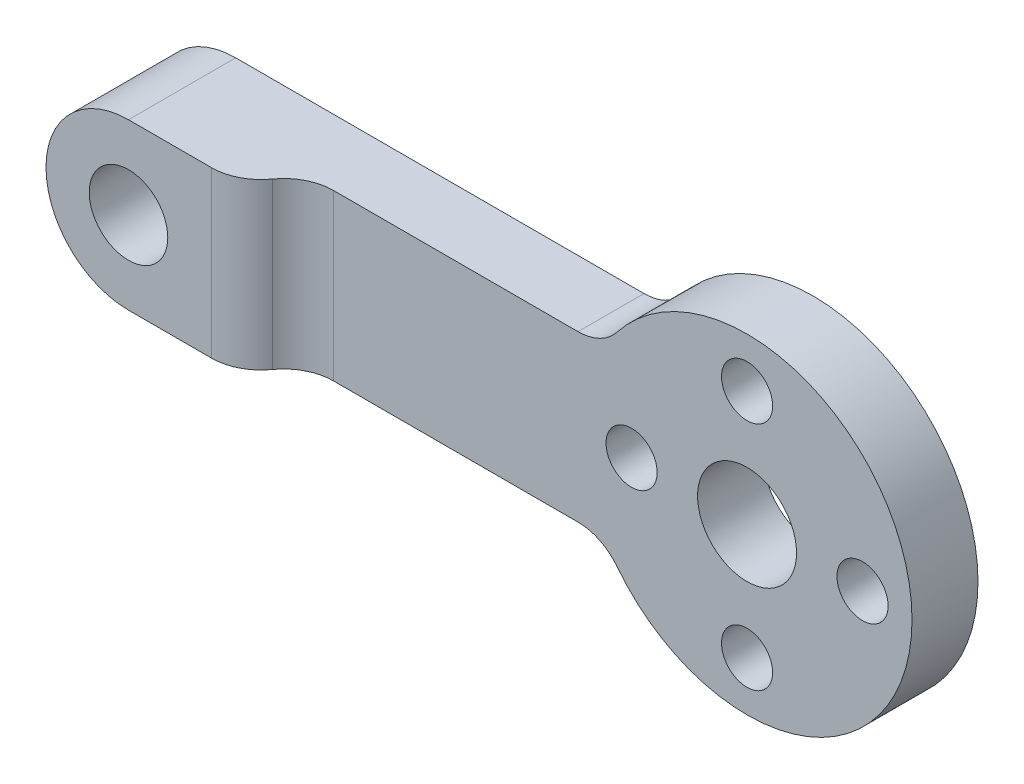
ISO-10303-21;
HEADER;
FILE_DESCRIPTION(('STEP AP214'),'2;1');
FILE_NAME('part.step','',(''),(''),'','','');
FILE_SCHEMA(('AUTOMOTIVE_DESIGN { 1 0 10303 214 1 1 1 1 }'));
ENDSEC;
DATA;
#1=APPLICATION_CONTEXT('core data for automotive mechanical design processes');
#2=APPLICATION_PROTOCOL_DEFINITION('international standard','automotive_design',2000,#1);
#3=PRODUCT_CONTEXT('',#1,'mechanical');
#4=PRODUCT('Part','Part','',(#3));
#5=PRODUCT_RELATED_PRODUCT_CATEGORY('part','',(#4));
#6=PRODUCT_DEFINITION_FORMATION('','',#4);
#7=PRODUCT_DEFINITION_CONTEXT('part definition',#1,'design');
#8=PRODUCT_DEFINITION('design','',#6,#7);
#9=PRODUCT_DEFINITION_SHAPE('','',#8);
#10=(LENGTH_UNIT() NAMED_UNIT(*) SI_UNIT(.MILLI.,.METRE.));
#11=(NAMED_UNIT(*) PLANE_ANGLE_UNIT() SI_UNIT($,.RADIAN.));
#12=(NAMED_UNIT(*) SI_UNIT($,.STERADIAN.) SOLID_ANGLE_UNIT());
#13=UNCERTAINTY_MEASURE_WITH_UNIT(LENGTH_MEASURE(1.E-05),#10,'distance_accuracy_value','');
#14=(GEOMETRIC_REPRESENTATION_CONTEXT(3) GLOBAL_UNCERTAINTY_ASSIGNED_CONTEXT((#13)) GLOBAL_UNIT_ASSIGNED_CONTEXT((#10,
#11,#12)) REPRESENTATION_CONTEXT('',''));
#15=CARTESIAN_POINT('',(0.,0.,0.));
#16=DIRECTION('',(0.,0.,1.));
#17=DIRECTION('',(1.,0.,0.));
#18=AXIS2_PLACEMENT_3D('',#15,#16,#17);
#19=CARTESIAN_POINT('',(-20.,0.,0.));
#20=DIRECTION('',(0.,0.,-1.));
#21=DIRECTION('',(-1.,0.,0.));
#22=AXIS2_PLACEMENT_3D('',#19,#20,#21);
#23=CYLINDRICAL_SURFACE('',#22,5.);
#24=DIRECTION('',(0.,0.,-1.));
#25=VECTOR('',#24,1.);
#26=CARTESIAN_POINT('',(-20.,5.,6.5));
#27=LINE('',#26,#25);
#28=CARTESIAN_POINT('',(-20.,5.,0.));
#29=VERTEX_POINT('',#28);
#30=CARTESIAN_POINT('',(-20.,5.,6.5));
#31=VERTEX_POINT('',#30);
#32=EDGE_CURVE('E133',#29,#31,#27,.F.);
#33=ORIENTED_EDGE('',*,*,#32,.F.);
#34=CARTESIAN_POINT('',(-20.,0.,0.));
#35=DIRECTION('',(0.,0.,1.));
#36=DIRECTION('',(1.,0.,0.));
#37=AXIS2_PLACEMENT_3D('',#34,#35,#36);
#38=CIRCLE('',#37,5.);
#39=CARTESIAN_POINT('',(-20.,-5.,0.));
#40=VERTEX_POINT('',#39);
#41=EDGE_CURVE('E51',#40,#29,#38,.F.);
#42=ORIENTED_EDGE('',*,*,#41,.F.);
#43=DIRECTION('',(0.,0.,-1.));
#44=VECTOR('',#43,1.);
#45=CARTESIAN_POINT('',(-20.,-5.,6.5));
#46=LINE('',#45,#44);
#47=CARTESIAN_POINT('',(-20.,-5.,6.5));
#48=VERTEX_POINT('',#47);
#49=EDGE_CURVE('E180',#48,#40,#46,.T.);
#50=ORIENTED_EDGE('',*,*,#49,.F.);
#51=CARTESIAN_POINT('',(-20.,0.,6.5));
#52=DIRECTION('',(0.,0.,1.));
#53=DIRECTION('',(1.,0.,0.));
#54=AXIS2_PLACEMENT_3D('',#51,#52,#53);
#55=CIRCLE('',#54,5.);
#56=EDGE_CURVE('E11',#31,#48,#55,.T.);
#57=ORIENTED_EDGE('',*,*,#56,.F.);
#58=EDGE_LOOP('',(#33,#42,#50,#57));
#59=FACE_BOUND('',#58,.T.);
#60=ADVANCED_FACE('F43',(#59),#23,.T.);
#61=CARTESIAN_POINT('',(15.,0.,6.5));
#62=DIRECTION('',(0.,0.,-1.));
#63=DIRECTION('',(-1.,0.,0.));
#64=AXIS2_PLACEMENT_3D('',#61,#62,#63);
#65=CYLINDRICAL_SURFACE('',#64,10.);
#66=CARTESIAN_POINT('',(15.,0.,4.));
#67=DIRECTION('',(0.,0.,-1.));
#68=DIRECTION('',(-1.,0.,0.));
#69=AXIS2_PLACEMENT_3D('',#66,#67,#68);
#70=CIRCLE('',#69,10.);
#71=CARTESIAN_POINT('',(7.11773018003108,6.15384615384615,4.));
#72=VERTEX_POINT('',#71);
#73=CARTESIAN_POINT('',(7.11773018003108,-6.15384615384615,4.));
#74=VERTEX_POINT('',#73);
#75=EDGE_CURVE('E199',#72,#74,#70,.T.);
#76=ORIENTED_EDGE('',*,*,#75,.T.);
#77=DIRECTION('',(0.,0.,-1.));
#78=VECTOR('',#77,1.);
#79=CARTESIAN_POINT('',(7.11773018003108,-6.15384615384615,6.5));
#80=LINE('',#79,#78);
#81=CARTESIAN_POINT('',(7.11773018003108,-6.15384615384615,0.));
#82=VERTEX_POINT('',#81);
#83=EDGE_CURVE('E155',#74,#82,#80,.T.);
#84=ORIENTED_EDGE('',*,*,#83,.T.);
#85=CARTESIAN_POINT('',(15.,0.,0.));
#86=DIRECTION('',(0.,0.,1.));
#87=DIRECTION('',(1.,0.,0.));
#88=AXIS2_PLACEMENT_3D('',#85,#86,#87);
#89=CIRCLE('',#88,10.);
#90=CARTESIAN_POINT('',(7.11773018003108,6.15384615384615,0.));
#91=VERTEX_POINT('',#90);
#92=EDGE_CURVE('E143',#82,#91,#89,.T.);
#93=ORIENTED_EDGE('',*,*,#92,.T.);
#94=DIRECTION('',(0.,0.,-1.));
#95=VECTOR('',#94,1.);
#96=CARTESIAN_POINT('',(7.11773018003108,6.15384615384615,6.5));
#97=LINE('',#96,#95);
#98=EDGE_CURVE('E153',#91,#72,#97,.F.);
#99=ORIENTED_EDGE('',*,*,#98,.T.);
#100=EDGE_LOOP('',(#76,#84,#93,#99));
#101=FACE_BOUND('',#100,.T.);
#102=ADVANCED_FACE('F196',(#101),#65,.T.);
#103=CARTESIAN_POINT('',(-25.,5.,6.5));
#104=DIRECTION('',(0.,-1.,0.));
#105=DIRECTION('',(0.,0.,-1.));
#106=AXIS2_PLACEMENT_3D('',#103,#104,#105);
#107=PLANE('',#106);
#108=DIRECTION('',(-1.,0.,0.));
#109=VECTOR('',#108,1.);
#110=CARTESIAN_POINT('',(-25.,5.,0.));
#111=LINE('',#110,#109);
#112=CARTESIAN_POINT('',(4.7530492340404,5.,0.));
#113=VERTEX_POINT('',#112);
#114=EDGE_CURVE('E137',#113,#29,#111,.T.);
#115=ORIENTED_EDGE('',*,*,#114,.T.);
#116=ORIENTED_EDGE('',*,*,#32,.T.);
#117=DIRECTION('',(-1.,0.,0.));
#118=VECTOR('',#117,1.);
#119=CARTESIAN_POINT('',(-25.,5.,6.5));
#120=LINE('',#119,#118);
#121=CARTESIAN_POINT('',(-14.9580398915498,5.,6.5));
#122=VERTEX_POINT('',#121);
#123=EDGE_CURVE('E125',#122,#31,#120,.T.);
#124=ORIENTED_EDGE('',*,*,#123,.F.);
#125=CARTESIAN_POINT('',(-14.9580398915498,5.,3.5));
#126=DIRECTION('',(0.,-1.,0.));
#127=DIRECTION('',(0.,0.,-1.));
#128=AXIS2_PLACEMENT_3D('',#125,#126,#127);
#129=CIRCLE('',#128,3.);
#130=CARTESIAN_POINT('',(-12.5213413053476,5.,5.25));
#131=VERTEX_POINT('',#130);
#132=EDGE_CURVE('E112',#122,#131,#129,.F.);
#133=ORIENTED_EDGE('',*,*,#132,.T.);
#134=CARTESIAN_POINT('',(-10.0846427191453,5.,7.));
#135=DIRECTION('',(0.,-1.,0.));
#136=DIRECTION('',(0.,0.,-1.));
#137=AXIS2_PLACEMENT_3D('',#134,#135,#136);
#138=CIRCLE('',#137,3.);
#139=CARTESIAN_POINT('',(-10.0846427191453,5.,4.));
#140=VERTEX_POINT('',#139);
#141=EDGE_CURVE('E175',#131,#140,#138,.T.);
#142=ORIENTED_EDGE('',*,*,#141,.T.);
#143=DIRECTION('',(1.,0.,0.));
#144=VECTOR('',#143,1.);
#145=CARTESIAN_POINT('',(-25.,5.,4.00000000000001));
#146=LINE('',#145,#144);
#147=CARTESIAN_POINT('',(4.7530492340404,5.,4.));
#148=VERTEX_POINT('',#147);
#149=EDGE_CURVE('E188',#140,#148,#146,.T.);
#150=ORIENTED_EDGE('',*,*,#149,.T.);
#151=DIRECTION('',(0.,0.,1.));
#152=VECTOR('',#151,1.);
#153=CARTESIAN_POINT('',(4.7530492340404,5.,0.));
#154=LINE('',#153,#152);
#155=EDGE_CURVE('E160',#148,#113,#154,.F.);
#156=ORIENTED_EDGE('',*,*,#155,.T.);
#157=EDGE_LOOP('',(#115,#116,#124,#133,#142,#150,#156));
#158=FACE_BOUND('',#157,.T.);
#159=ADVANCED_FACE('F132',(#158),#107,.F.);
#160=CARTESIAN_POINT('',(-25.,-5.,6.5));
#161=DIRECTION('',(0.,1.,0.));
#162=DIRECTION('',(0.,0.,1.));
#163=AXIS2_PLACEMENT_3D('',#160,#161,#162);
#164=PLANE('',#163);
#165=DIRECTION('',(1.,0.,0.));
#166=VECTOR('',#165,1.);
#167=CARTESIAN_POINT('',(-25.,-5.,6.5));
#168=LINE('',#167,#166);
#169=CARTESIAN_POINT('',(-14.9580398915498,-5.,6.5));
#170=VERTEX_POINT('',#169);
#171=EDGE_CURVE('E127',#48,#170,#168,.T.);
#172=ORIENTED_EDGE('',*,*,#171,.F.);
#173=ORIENTED_EDGE('',*,*,#49,.T.);
#174=DIRECTION('',(1.,0.,0.));
#175=VECTOR('',#174,1.);
#176=CARTESIAN_POINT('',(-25.,-5.,0.));
#177=LINE('',#176,#175);
#178=CARTESIAN_POINT('',(4.7530492340404,-5.,0.));
#179=VERTEX_POINT('',#178);
#180=EDGE_CURVE('E134',#40,#179,#177,.T.);
#181=ORIENTED_EDGE('',*,*,#180,.T.);
#182=DIRECTION('',(0.,0.,1.));
#183=VECTOR('',#182,1.);
#184=CARTESIAN_POINT('',(4.7530492340404,-5.,4.));
#185=LINE('',#184,#183);
#186=CARTESIAN_POINT('',(4.7530492340404,-5.,4.));
#187=VERTEX_POINT('',#186);
#188=EDGE_CURVE('E158',#179,#187,#185,.T.);
#189=ORIENTED_EDGE('',*,*,#188,.T.);
#190=DIRECTION('',(-1.,0.,0.));
#191=VECTOR('',#190,1.);
#192=CARTESIAN_POINT('',(-25.,-5.,4.00000000000001));
#193=LINE('',#192,#191);
#194=CARTESIAN_POINT('',(-10.0846427191453,-5.,4.));
#195=VERTEX_POINT('',#194);
#196=EDGE_CURVE('E208',#187,#195,#193,.T.);
#197=ORIENTED_EDGE('',*,*,#196,.T.);
#198=CARTESIAN_POINT('',(-10.0846427191453,-5.,7.));
#199=DIRECTION('',(0.,1.,0.));
#200=DIRECTION('',(0.,0.,1.));
#201=AXIS2_PLACEMENT_3D('',#198,#199,#200);
#202=CIRCLE('',#201,3.);
#203=CARTESIAN_POINT('',(-12.5213413053476,-5.,5.25));
#204=VERTEX_POINT('',#203);
#205=EDGE_CURVE('E177',#195,#204,#202,.T.);
#206=ORIENTED_EDGE('',*,*,#205,.T.);
#207=CARTESIAN_POINT('',(-14.9580398915498,-5.,3.5));
#208=DIRECTION('',(0.,1.,0.));
#209=DIRECTION('',(0.,0.,1.));
#210=AXIS2_PLACEMENT_3D('',#207,#208,#209);
#211=CIRCLE('',#210,3.);
#212=EDGE_CURVE('E121',#204,#170,#211,.F.);
#213=ORIENTED_EDGE('',*,*,#212,.T.);
#214=EDGE_LOOP('',(#172,#173,#181,#189,#197,#206,#213));
#215=FACE_BOUND('',#214,.T.);
#216=ADVANCED_FACE('F207',(#215),#164,.F.);
#217=CARTESIAN_POINT('',(15.,0.,6.5));
#218=DIRECTION('',(0.,0.,1.));
#219=DIRECTION('',(1.,0.,0.));
#220=AXIS2_PLACEMENT_3D('',#217,#218,#219);
#221=PLANE('',#220);
#222=ORIENTED_EDGE('',*,*,#123,.T.);
#223=ORIENTED_EDGE('',*,*,#56,.T.);
#224=ORIENTED_EDGE('',*,*,#171,.T.);
#225=DIRECTION('',(0.,1.,0.));
#226=VECTOR('',#225,1.);
#227=CARTESIAN_POINT('',(-14.9580398915498,5.,6.5));
#228=LINE('',#227,#226);
#229=EDGE_CURVE('E116',#170,#122,#228,.T.);
#230=ORIENTED_EDGE('',*,*,#229,.T.);
#231=EDGE_LOOP('',(#222,#223,#224,#230));
#232=FACE_BOUND('',#231,.T.);
#233=CARTESIAN_POINT('',(-20.,0.,6.5));
#234=DIRECTION('',(0.,0.,1.));
#235=DIRECTION('',(1.,0.,0.));
#236=AXIS2_PLACEMENT_3D('',#233,#234,#235);
#237=CIRCLE('',#236,2.38125);
#238=CARTESIAN_POINT('',(-17.61875,0.,6.5));
#239=VERTEX_POINT('',#238);
#240=EDGE_CURVE('E222',#239,#239,#237,.T.);
#241=ORIENTED_EDGE('',*,*,#240,.F.);
#242=EDGE_LOOP('',(#241));
#243=FACE_BOUND('',#242,.T.);
#244=ADVANCED_FACE('F123',(#232,#243),#221,.T.);
#245=CARTESIAN_POINT('',(15.,0.,0.));
#246=DIRECTION('',(0.,0.,1.));
#247=DIRECTION('',(1.,0.,0.));
#248=AXIS2_PLACEMENT_3D('',#245,#246,#247);
#249=PLANE('',#248);
#250=CARTESIAN_POINT('',(-20.,0.,0.));
#251=DIRECTION('',(0.,0.,1.));
#252=DIRECTION('',(1.,0.,0.));
#253=AXIS2_PLACEMENT_3D('',#250,#251,#252);
#254=CIRCLE('',#253,2.38125);
#255=CARTESIAN_POINT('',(-17.61875,0.,0.));
#256=VERTEX_POINT('',#255);
#257=EDGE_CURVE('E146',#256,#256,#254,.F.);
#258=ORIENTED_EDGE('',*,*,#257,.F.);
#259=EDGE_LOOP('',(#258));
#260=FACE_BOUND('',#259,.T.);
#261=CARTESIAN_POINT('',(8.,0.,0.));
#262=DIRECTION('',(0.,0.,1.));
#263=DIRECTION('',(1.,0.,0.));
#264=AXIS2_PLACEMENT_3D('',#261,#262,#263);
#265=CIRCLE('',#264,1.55);
#266=CARTESIAN_POINT('',(9.55,0.,0.));
#267=VERTEX_POINT('',#266);
#268=EDGE_CURVE('E232',#267,#267,#265,.F.);
#269=ORIENTED_EDGE('',*,*,#268,.F.);
#270=EDGE_LOOP('',(#269));
#271=FACE_BOUND('',#270,.T.);
#272=CARTESIAN_POINT('',(15.,-7.,0.));
#273=DIRECTION('',(0.,0.,1.));
#274=DIRECTION('',(1.,0.,0.));
#275=AXIS2_PLACEMENT_3D('',#272,#273,#274);
#276=CIRCLE('',#275,1.55);
#277=CARTESIAN_POINT('',(16.55,-7.,0.));
#278=VERTEX_POINT('',#277);
#279=EDGE_CURVE('E228',#278,#278,#276,.F.);
#280=ORIENTED_EDGE('',*,*,#279,.F.);
#281=EDGE_LOOP('',(#280));
#282=FACE_BOUND('',#281,.T.);
#283=CARTESIAN_POINT('',(22.,0.,0.));
#284=DIRECTION('',(0.,0.,1.));
#285=DIRECTION('',(1.,0.,0.));
#286=AXIS2_PLACEMENT_3D('',#283,#284,#285);
#287=CIRCLE('',#286,1.55);
#288=CARTESIAN_POINT('',(23.55,0.,0.));
#289=VERTEX_POINT('',#288);
#290=EDGE_CURVE('E231',#289,#289,#287,.F.);
#291=ORIENTED_EDGE('',*,*,#290,.F.);
#292=EDGE_LOOP('',(#291));
#293=FACE_BOUND('',#292,.T.);
#294=CARTESIAN_POINT('',(15.,0.,0.));
#295=DIRECTION('',(0.,0.,1.));
#296=DIRECTION('',(1.,0.,0.));
#297=AXIS2_PLACEMENT_3D('',#294,#295,#296);
#298=CIRCLE('',#297,3.);
#299=CARTESIAN_POINT('',(18.,0.,0.));
#300=VERTEX_POINT('',#299);
#301=EDGE_CURVE('E225',#300,#300,#298,.F.);
#302=ORIENTED_EDGE('',*,*,#301,.F.);
#303=EDGE_LOOP('',(#302));
#304=FACE_BOUND('',#303,.T.);
#305=CARTESIAN_POINT('',(15.,7.,0.));
#306=DIRECTION('',(0.,0.,1.));
#307=DIRECTION('',(1.,0.,0.));
#308=AXIS2_PLACEMENT_3D('',#305,#306,#307);
#309=CIRCLE('',#308,1.55);
#310=CARTESIAN_POINT('',(16.55,7.,0.));
#311=VERTEX_POINT('',#310);
#312=EDGE_CURVE('E140',#311,#311,#309,.F.);
#313=ORIENTED_EDGE('',*,*,#312,.F.);
#314=EDGE_LOOP('',(#313));
#315=FACE_BOUND('',#314,.T.);
#316=ORIENTED_EDGE('',*,*,#180,.F.);
#317=ORIENTED_EDGE('',*,*,#41,.T.);
#318=ORIENTED_EDGE('',*,*,#114,.F.);
#319=CARTESIAN_POINT('',(4.7530492340404,8.,0.));
#320=DIRECTION('',(0.,0.,1.));
#321=DIRECTION('',(1.,0.,0.));
#322=AXIS2_PLACEMENT_3D('',#319,#320,#321);
#323=CIRCLE('',#322,3.);
#324=EDGE_CURVE('E171',#113,#91,#323,.T.);
#325=ORIENTED_EDGE('',*,*,#324,.T.);
#326=ORIENTED_EDGE('',*,*,#92,.F.);
#327=CARTESIAN_POINT('',(4.7530492340404,-7.99999999999999,0.));
#328=DIRECTION('',(0.,0.,1.));
#329=DIRECTION('',(1.,0.,0.));
#330=AXIS2_PLACEMENT_3D('',#327,#328,#329);
#331=CIRCLE('',#330,3.);
#332=EDGE_CURVE('E166',#82,#179,#331,.T.);
#333=ORIENTED_EDGE('',*,*,#332,.T.);
#334=EDGE_LOOP('',(#316,#317,#318,#325,#326,#333));
#335=FACE_BOUND('',#334,.T.);
#336=ADVANCED_FACE('F184',(#260,#271,#282,#293,#304,#315,#335),#249,.F.);
#337=CARTESIAN_POINT('',(15.,7.,-8.48528137423858));
#338=DIRECTION('',(0.,0.,1.));
#339=DIRECTION('',(1.,0.,0.));
#340=AXIS2_PLACEMENT_3D('',#337,#338,#339);
#341=CYLINDRICAL_SURFACE('',#340,1.55);
#342=CARTESIAN_POINT('',(15.,7.,4.));
#343=DIRECTION('',(0.,0.,-1.));
#344=DIRECTION('',(-1.,0.,0.));
#345=AXIS2_PLACEMENT_3D('',#342,#343,#344);
#346=CIRCLE('',#345,1.55);
#347=CARTESIAN_POINT('',(16.55,7.,4.));
#348=VERTEX_POINT('',#347);
#349=EDGE_CURVE('E213',#348,#348,#346,.F.);
#350=CARTESIAN_POINT('',(16.55,7.,4.));
#351=CARTESIAN_POINT('',(16.55,7.,3.95833333333334));
#352=CARTESIAN_POINT('',(16.55,7.,3.91666666666667));
#353=CARTESIAN_POINT('',(16.55,7.,3.83333333333333));
#354=CARTESIAN_POINT('',(16.55,7.,3.79166666666667));
#355=CARTESIAN_POINT('',(16.55,7.,3.70833333333333));
#356=CARTESIAN_POINT('',(16.55,7.,3.66666666666667));
#357=CARTESIAN_POINT('',(16.55,7.,3.58333333333333));
#358=CARTESIAN_POINT('',(16.55,7.,3.54166666666667));
#359=CARTESIAN_POINT('',(16.55,7.,3.45833333333333));
#360=CARTESIAN_POINT('',(16.55,7.,3.41666666666667));
#361=CARTESIAN_POINT('',(16.55,7.,3.33333333333333));
#362=CARTESIAN_POINT('',(16.55,7.,3.29166666666667));
#363=CARTESIAN_POINT('',(16.55,7.,3.20833333333333));
#364=CARTESIAN_POINT('',(16.55,7.,3.16666666666667));
#365=CARTESIAN_POINT('',(16.55,7.,3.08333333333333));
#366=CARTESIAN_POINT('',(16.55,7.,3.04166666666667));
#367=CARTESIAN_POINT('',(16.55,7.,2.95833333333333));
#368=CARTESIAN_POINT('',(16.55,7.,2.91666666666667));
#369=CARTESIAN_POINT('',(16.55,7.,2.83333333333333));
#370=CARTESIAN_POINT('',(16.55,7.,2.79166666666667));
#371=CARTESIAN_POINT('',(16.55,7.,2.70833333333333));
#372=CARTESIAN_POINT('',(16.55,7.,2.66666666666667));
#373=CARTESIAN_POINT('',(16.55,7.,2.58333333333333));
#374=CARTESIAN_POINT('',(16.55,7.,2.54166666666667));
#375=CARTESIAN_POINT('',(16.55,7.,2.45833333333333));
#376=CARTESIAN_POINT('',(16.55,7.,2.41666666666667));
#377=CARTESIAN_POINT('',(16.55,7.,2.33333333333333));
#378=CARTESIAN_POINT('',(16.55,7.,2.29166666666667));
#379=CARTESIAN_POINT('',(16.55,7.,2.20833333333333));
#380=CARTESIAN_POINT('',(16.55,7.,2.16666666666667));
#381=CARTESIAN_POINT('',(16.55,7.,2.08333333333333));
#382=CARTESIAN_POINT('',(16.55,7.,2.04166666666667));
#383=CARTESIAN_POINT('',(16.55,7.,1.95833333333333));
#384=CARTESIAN_POINT('',(16.55,7.,1.91666666666667));
#385=CARTESIAN_POINT('',(16.55,7.,1.83333333333333));
#386=CARTESIAN_POINT('',(16.55,7.,1.79166666666667));
#387=CARTESIAN_POINT('',(16.55,7.,1.70833333333333));
#388=CARTESIAN_POINT('',(16.55,7.,1.66666666666667));
#389=CARTESIAN_POINT('',(16.55,7.,1.58333333333333));
#390=CARTESIAN_POINT('',(16.55,7.,1.54166666666667));
#391=CARTESIAN_POINT('',(16.55,7.,1.45833333333333));
#392=CARTESIAN_POINT('',(16.55,7.,1.41666666666667));
#393=CARTESIAN_POINT('',(16.55,7.,1.33333333333333));
#394=CARTESIAN_POINT('',(16.55,7.,1.29166666666667));
#395=CARTESIAN_POINT('',(16.55,7.,1.20833333333333));
#396=CARTESIAN_POINT('',(16.55,7.,1.16666666666667));
#397=CARTESIAN_POINT('',(16.55,7.,1.08333333333333));
#398=CARTESIAN_POINT('',(16.55,7.,1.04166666666667));
#399=CARTESIAN_POINT('',(16.55,7.,0.958333333333332));
#400=CARTESIAN_POINT('',(16.55,7.,0.916666666666666));
#401=CARTESIAN_POINT('',(16.55,7.,0.833333333333332));
#402=CARTESIAN_POINT('',(16.55,7.,0.791666666666666));
#403=CARTESIAN_POINT('',(16.55,7.,0.708333333333332));
#404=CARTESIAN_POINT('',(16.55,7.,0.666666666666666));
#405=CARTESIAN_POINT('',(16.55,7.,0.583333333333332));
#406=CARTESIAN_POINT('',(16.55,7.,0.541666666666665));
#407=CARTESIAN_POINT('',(16.55,7.,0.458333333333332));
#408=CARTESIAN_POINT('',(16.55,7.,0.416666666666665));
#409=CARTESIAN_POINT('',(16.55,7.,0.333333333333332));
#410=CARTESIAN_POINT('',(16.55,7.,0.291666666666665));
#411=CARTESIAN_POINT('',(16.55,7.,0.208333333333332));
#412=CARTESIAN_POINT('',(16.55,7.,0.166666666666665));
#413=CARTESIAN_POINT('',(16.55,7.,0.0833333333333317));
#414=CARTESIAN_POINT('',(16.55,7.,0.0416666666666649));
#415=CARTESIAN_POINT('',(16.55,7.,0.));
#416=B_SPLINE_CURVE_WITH_KNOTS('',3,(#350,#351,#352,#353,#354,#355,#356,#357,#358,#359,#360,
#361,#362,#363,#364,#365,#366,#367,#368,#369,#370,#371,#372,#373,#374,#375,#376,#377,#378,#379,
#380,#381,#382,#383,#384,#385,#386,#387,#388,#389,#390,#391,#392,#393,#394,#395,#396,#397,#398,
#399,#400,#401,#402,#403,#404,#405,#406,#407,#408,#409,#410,#411,#412,#413,#414,#415),
.UNSPECIFIED.,.F.,.F.,(4,2,2,2,2,2,2,2,2,2,2,2,2,2,2,2,2,2,2,2,2,2,2,2,2,2,2,2,2,2,2,2,4),(0.,
0.125,0.25,0.375,0.5,0.625000000000001,0.750000000000001,0.875000000000001,1.,1.125,1.25,1.375,
1.5,1.625,1.75,1.875,2.,2.125,2.25,2.375,2.5,2.625,2.75,2.875,3.,3.125,3.25,3.375,3.5,3.625,
3.75,3.875,4.),.UNSPECIFIED.);
#417=EDGE_CURVE('BSEAM243',#348,#311,#416,.T.);
#418=ORIENTED_EDGE('',*,*,#349,.T.);
#419=ORIENTED_EDGE('',*,*,#312,.T.);
#420=ORIENTED_EDGE('',*,*,#417,.T.);
#421=ORIENTED_EDGE('',*,*,#417,.F.);
#422=EDGE_LOOP('',(#418,#420,#419,#421));
#423=FACE_BOUND('',#422,.T.);
#424=ADVANCED_FACE('F243',(#423),#341,.F.);
#425=CARTESIAN_POINT('',(15.,0.,-8.48528137423858));
#426=DIRECTION('',(0.,0.,1.));
#427=DIRECTION('',(1.,0.,0.));
#428=AXIS2_PLACEMENT_3D('',#425,#426,#427);
#429=CYLINDRICAL_SURFACE('',#428,3.);
#430=CARTESIAN_POINT('',(15.,0.,4.));
#431=DIRECTION('',(0.,0.,-1.));
#432=DIRECTION('',(-1.,0.,0.));
#433=AXIS2_PLACEMENT_3D('',#430,#431,#432);
#434=CIRCLE('',#433,3.);
#435=CARTESIAN_POINT('',(18.,0.,4.));
#436=VERTEX_POINT('',#435);
#437=EDGE_CURVE('E217',#436,#436,#434,.F.);
#438=CARTESIAN_POINT('',(18.,0.,4.));
#439=CARTESIAN_POINT('',(18.,0.,3.95833333333334));
#440=CARTESIAN_POINT('',(18.,0.,3.91666666666667));
#441=CARTESIAN_POINT('',(18.,0.,3.83333333333333));
#442=CARTESIAN_POINT('',(18.,0.,3.79166666666667));
#443=CARTESIAN_POINT('',(18.,0.,3.70833333333333));
#444=CARTESIAN_POINT('',(18.,0.,3.66666666666667));
#445=CARTESIAN_POINT('',(18.,0.,3.58333333333333));
#446=CARTESIAN_POINT('',(18.,0.,3.54166666666667));
#447=CARTESIAN_POINT('',(18.,0.,3.45833333333333));
#448=CARTESIAN_POINT('',(18.,0.,3.41666666666667));
#449=CARTESIAN_POINT('',(18.,0.,3.33333333333333));
#450=CARTESIAN_POINT('',(18.,0.,3.29166666666667));
#451=CARTESIAN_POINT('',(18.,0.,3.20833333333333));
#452=CARTESIAN_POINT('',(18.,0.,3.16666666666667));
#453=CARTESIAN_POINT('',(18.,0.,3.08333333333333));
#454=CARTESIAN_POINT('',(18.,0.,3.04166666666667));
#455=CARTESIAN_POINT('',(18.,0.,2.95833333333333));
#456=CARTESIAN_POINT('',(18.,0.,2.91666666666667));
#457=CARTESIAN_POINT('',(18.,0.,2.83333333333333));
#458=CARTESIAN_POINT('',(18.,0.,2.79166666666667));
#459=CARTESIAN_POINT('',(18.,0.,2.70833333333333));
#460=CARTESIAN_POINT('',(18.,0.,2.66666666666667));
#461=CARTESIAN_POINT('',(18.,0.,2.58333333333333));
#462=CARTESIAN_POINT('',(18.,0.,2.54166666666667));
#463=CARTESIAN_POINT('',(18.,0.,2.45833333333333));
#464=CARTESIAN_POINT('',(18.,0.,2.41666666666667));
#465=CARTESIAN_POINT('',(18.,0.,2.33333333333333));
#466=CARTESIAN_POINT('',(18.,0.,2.29166666666667));
#467=CARTESIAN_POINT('',(18.,0.,2.20833333333333));
#468=CARTESIAN_POINT('',(18.,0.,2.16666666666667));
#469=CARTESIAN_POINT('',(18.,0.,2.08333333333333));
#470=CARTESIAN_POINT('',(18.,0.,2.04166666666667));
#471=CARTESIAN_POINT('',(18.,0.,1.95833333333333));
#472=CARTESIAN_POINT('',(18.,0.,1.91666666666667));
#473=CARTESIAN_POINT('',(18.,0.,1.83333333333333));
#474=CARTESIAN_POINT('',(18.,0.,1.79166666666667));
#475=CARTESIAN_POINT('',(18.,0.,1.70833333333333));
#476=CARTESIAN_POINT('',(18.,0.,1.66666666666667));
#477=CARTESIAN_POINT('',(18.,0.,1.58333333333333));
#478=CARTESIAN_POINT('',(18.,0.,1.54166666666667));
#479=CARTESIAN_POINT('',(18.,0.,1.45833333333333));
#480=CARTESIAN_POINT('',(18.,0.,1.41666666666667));
#481=CARTESIAN_POINT('',(18.,0.,1.33333333333333));
#482=CARTESIAN_POINT('',(18.,0.,1.29166666666667));
#483=CARTESIAN_POINT('',(18.,0.,1.20833333333333));
#484=CARTESIAN_POINT('',(18.,0.,1.16666666666667));
#485=CARTESIAN_POINT('',(18.,0.,1.08333333333333));
#486=CARTESIAN_POINT('',(18.,0.,1.04166666666667));
#487=CARTESIAN_POINT('',(18.,0.,0.958333333333332));
#488=CARTESIAN_POINT('',(18.,0.,0.916666666666666));
#489=CARTESIAN_POINT('',(18.,0.,0.833333333333332));
#490=CARTESIAN_POINT('',(18.,0.,0.791666666666666));
#491=CARTESIAN_POINT('',(18.,0.,0.708333333333332));
#492=CARTESIAN_POINT('',(18.,0.,0.666666666666666));
#493=CARTESIAN_POINT('',(18.,0.,0.583333333333332));
#494=CARTESIAN_POINT('',(18.,0.,0.541666666666665));
#495=CARTESIAN_POINT('',(18.,0.,0.458333333333332));
#496=CARTESIAN_POINT('',(18.,0.,0.416666666666665));
#497=CARTESIAN_POINT('',(18.,0.,0.333333333333332));
#498=CARTESIAN_POINT('',(18.,0.,0.291666666666665));
#499=CARTESIAN_POINT('',(18.,0.,0.208333333333332));
#500=CARTESIAN_POINT('',(18.,0.,0.166666666666665));
#501=CARTESIAN_POINT('',(18.,0.,0.0833333333333317));
#502=CARTESIAN_POINT('',(18.,0.,0.0416666666666649));
#503=CARTESIAN_POINT('',(18.,0.,0.));
#504=B_SPLINE_CURVE_WITH_KNOTS('',3,(#438,#439,#440,#441,#442,#443,#444,#445,#446,#447,#448,
#449,#450,#451,#452,#453,#454,#455,#456,#457,#458,#459,#460,#461,#462,#463,#464,#465,#466,#467,
#468,#469,#470,#471,#472,#473,#474,#475,#476,#477,#478,#479,#480,#481,#482,#483,#484,#485,#486,
#487,#488,#489,#490,#491,#492,#493,#494,#495,#496,#497,#498,#499,#500,#501,#502,#503),
.UNSPECIFIED.,.F.,.F.,(4,2,2,2,2,2,2,2,2,2,2,2,2,2,2,2,2,2,2,2,2,2,2,2,2,2,2,2,2,2,2,2,4),(0.,
0.125,0.25,0.375,0.5,0.625000000000001,0.750000000000001,0.875000000000001,1.,1.125,1.25,1.375,
1.5,1.625,1.75,1.875,2.,2.125,2.25,2.375,2.5,2.625,2.75,2.875,3.,3.125,3.25,3.375,3.5,3.625,
3.75,3.875,4.),.UNSPECIFIED.);
#505=EDGE_CURVE('BSEAM252',#436,#300,#504,.T.);
#506=ORIENTED_EDGE('',*,*,#437,.T.);
#507=ORIENTED_EDGE('',*,*,#301,.T.);
#508=ORIENTED_EDGE('',*,*,#505,.T.);
#509=ORIENTED_EDGE('',*,*,#505,.F.);
#510=EDGE_LOOP('',(#506,#508,#507,#509));
#511=FACE_BOUND('',#510,.T.);
#512=ADVANCED_FACE('F252',(#511),#429,.F.);
#513=CARTESIAN_POINT('',(22.,0.,-8.48528137423858));
#514=DIRECTION('',(0.,0.,1.));
#515=DIRECTION('',(1.,0.,0.));
#516=AXIS2_PLACEMENT_3D('',#513,#514,#515);
#517=CYLINDRICAL_SURFACE('',#516,1.55);
#518=CARTESIAN_POINT('',(22.,0.,4.));
#519=DIRECTION('',(0.,0.,-1.));
#520=DIRECTION('',(-1.,0.,0.));
#521=AXIS2_PLACEMENT_3D('',#518,#519,#520);
#522=CIRCLE('',#521,1.55);
#523=CARTESIAN_POINT('',(23.55,0.,4.));
#524=VERTEX_POINT('',#523);
#525=EDGE_CURVE('E390',#524,#524,#522,.F.);
#526=CARTESIAN_POINT('',(23.55,0.,4.));
#527=CARTESIAN_POINT('',(23.55,0.,3.95833333333333));
#528=CARTESIAN_POINT('',(23.55,0.,3.91666666666666));
#529=CARTESIAN_POINT('',(23.55,0.,3.83333333333333));
#530=CARTESIAN_POINT('',(23.55,0.,3.79166666666667));
#531=CARTESIAN_POINT('',(23.55,0.,3.70833333333333));
#532=CARTESIAN_POINT('',(23.55,0.,3.66666666666666));
#533=CARTESIAN_POINT('',(23.55,0.,3.58333333333333));
#534=CARTESIAN_POINT('',(23.55,0.,3.54166666666666));
#535=CARTESIAN_POINT('',(23.55,0.,3.45833333333333));
#536=CARTESIAN_POINT('',(23.55,0.,3.41666666666666));
#537=CARTESIAN_POINT('',(23.55,0.,3.33333333333333));
#538=CARTESIAN_POINT('',(23.55,0.,3.29166666666666));
#539=CARTESIAN_POINT('',(23.55,0.,3.20833333333333));
#540=CARTESIAN_POINT('',(23.55,0.,3.16666666666666));
#541=CARTESIAN_POINT('',(23.55,0.,3.08333333333333));
#542=CARTESIAN_POINT('',(23.55,0.,3.04166666666666));
#543=CARTESIAN_POINT('',(23.55,0.,2.95833333333333));
#544=CARTESIAN_POINT('',(23.55,0.,2.91666666666666));
#545=CARTESIAN_POINT('',(23.55,0.,2.83333333333333));
#546=CARTESIAN_POINT('',(23.55,0.,2.79166666666666));
#547=CARTESIAN_POINT('',(23.55,0.,2.70833333333333));
#548=CARTESIAN_POINT('',(23.55,0.,2.66666666666667));
#549=CARTESIAN_POINT('',(23.55,0.,2.58333333333333));
#550=CARTESIAN_POINT('',(23.55,0.,2.54166666666667));
#551=CARTESIAN_POINT('',(23.55,0.,2.45833333333333));
#552=CARTESIAN_POINT('',(23.55,0.,2.41666666666667));
#553=CARTESIAN_POINT('',(23.55,0.,2.33333333333333));
#554=CARTESIAN_POINT('',(23.55,0.,2.29166666666667));
#555=CARTESIAN_POINT('',(23.55,0.,2.20833333333333));
#556=CARTESIAN_POINT('',(23.55,0.,2.16666666666667));
#557=CARTESIAN_POINT('',(23.55,0.,2.08333333333333));
#558=CARTESIAN_POINT('',(23.55,0.,2.04166666666667));
#559=CARTESIAN_POINT('',(23.55,0.,1.95833333333333));
#560=CARTESIAN_POINT('',(23.55,0.,1.91666666666666));
#561=CARTESIAN_POINT('',(23.55,0.,1.83333333333333));
#562=CARTESIAN_POINT('',(23.55,0.,1.79166666666666));
#563=CARTESIAN_POINT('',(23.55,0.,1.70833333333333));
#564=CARTESIAN_POINT('',(23.55,0.,1.66666666666666));
#565=CARTESIAN_POINT('',(23.55,0.,1.58333333333333));
#566=CARTESIAN_POINT('',(23.55,0.,1.54166666666666));
#567=CARTESIAN_POINT('',(23.55,0.,1.45833333333333));
#568=CARTESIAN_POINT('',(23.55,0.,1.41666666666666));
#569=CARTESIAN_POINT('',(23.55,0.,1.33333333333333));
#570=CARTESIAN_POINT('',(23.55,0.,1.29166666666667));
#571=CARTESIAN_POINT('',(23.55,0.,1.20833333333333));
#572=CARTESIAN_POINT('',(23.55,0.,1.16666666666667));
#573=CARTESIAN_POINT('',(23.55,0.,1.08333333333333));
#574=CARTESIAN_POINT('',(23.55,0.,1.04166666666667));
#575=CARTESIAN_POINT('',(23.55,0.,0.958333333333332));
#576=CARTESIAN_POINT('',(23.55,0.,0.916666666666666));
#577=CARTESIAN_POINT('',(23.55,0.,0.833333333333332));
#578=CARTESIAN_POINT('',(23.55,0.,0.791666666666666));
#579=CARTESIAN_POINT('',(23.55,0.,0.708333333333332));
#580=CARTESIAN_POINT('',(23.55,0.,0.666666666666666));
#581=CARTESIAN_POINT('',(23.55,0.,0.583333333333332));
#582=CARTESIAN_POINT('',(23.55,0.,0.541666666666665));
#583=CARTESIAN_POINT('',(23.55,0.,0.458333333333332));
#584=CARTESIAN_POINT('',(23.55,0.,0.416666666666665));
#585=CARTESIAN_POINT('',(23.55,0.,0.333333333333332));
#586=CARTESIAN_POINT('',(23.55,0.,0.291666666666665));
#587=CARTESIAN_POINT('',(23.55,0.,0.208333333333332));
#588=CARTESIAN_POINT('',(23.55,0.,0.166666666666665));
#589=CARTESIAN_POINT('',(23.55,0.,0.0833333333333317));
#590=CARTESIAN_POINT('',(23.55,0.,0.0416666666666649));
#591=CARTESIAN_POINT('',(23.55,0.,0.));
#592=B_SPLINE_CURVE_WITH_KNOTS('',3,(#526,#527,#528,#529,#530,#531,#532,#533,#534,#535,#536,
#537,#538,#539,#540,#541,#542,#543,#544,#545,#546,#547,#548,#549,#550,#551,#552,#553,#554,#555,
#556,#557,#558,#559,#560,#561,#562,#563,#564,#565,#566,#567,#568,#569,#570,#571,#572,#573,#574,
#575,#576,#577,#578,#579,#580,#581,#582,#583,#584,#585,#586,#587,#588,#589,#590,#591),
.UNSPECIFIED.,.F.,.F.,(4,2,2,2,2,2,2,2,2,2,2,2,2,2,2,2,2,2,2,2,2,2,2,2,2,2,2,2,2,2,2,2,4),(0.,
0.125,0.25,0.375,0.5,0.625000000000001,0.750000000000001,0.875000000000001,1.,1.125,1.25,1.375,
1.5,1.625,1.75,1.875,2.,2.125,2.25,2.375,2.5,2.625,2.75,2.875,3.,3.125,3.25,3.375,3.5,3.625,
3.75,3.875,4.),.UNSPECIFIED.);
#593=EDGE_CURVE('BSEAM239',#524,#289,#592,.T.);
#594=ORIENTED_EDGE('',*,*,#525,.T.);
#595=ORIENTED_EDGE('',*,*,#290,.T.);
#596=ORIENTED_EDGE('',*,*,#593,.T.);
#597=ORIENTED_EDGE('',*,*,#593,.F.);
#598=EDGE_LOOP('',(#594,#596,#595,#597));
#599=FACE_BOUND('',#598,.T.);
#600=ADVANCED_FACE('F239',(#599),#517,.F.);
#601=CARTESIAN_POINT('',(15.,-7.,-8.48528137423858));
#602=DIRECTION('',(0.,0.,1.));
#603=DIRECTION('',(1.,0.,0.));
#604=AXIS2_PLACEMENT_3D('',#601,#602,#603);
#605=CYLINDRICAL_SURFACE('',#604,1.55);
#606=CARTESIAN_POINT('',(15.,-7.,4.));
#607=DIRECTION('',(0.,0.,-1.));
#608=DIRECTION('',(-1.,0.,0.));
#609=AXIS2_PLACEMENT_3D('',#606,#607,#608);
#610=CIRCLE('',#609,1.55);
#611=CARTESIAN_POINT('',(16.55,-7.,4.));
#612=VERTEX_POINT('',#611);
#613=EDGE_CURVE('E150',#612,#612,#610,.F.);
#614=CARTESIAN_POINT('',(16.55,-7.,4.));
#615=CARTESIAN_POINT('',(16.55,-7.,3.95833333333334));
#616=CARTESIAN_POINT('',(16.55,-7.,3.91666666666667));
#617=CARTESIAN_POINT('',(16.55,-7.,3.83333333333333));
#618=CARTESIAN_POINT('',(16.55,-7.,3.79166666666667));
#619=CARTESIAN_POINT('',(16.55,-7.,3.70833333333333));
#620=CARTESIAN_POINT('',(16.55,-7.,3.66666666666667));
#621=CARTESIAN_POINT('',(16.55,-7.,3.58333333333333));
#622=CARTESIAN_POINT('',(16.55,-7.,3.54166666666667));
#623=CARTESIAN_POINT('',(16.55,-7.,3.45833333333333));
#624=CARTESIAN_POINT('',(16.55,-7.,3.41666666666667));
#625=CARTESIAN_POINT('',(16.55,-7.,3.33333333333333));
#626=CARTESIAN_POINT('',(16.55,-7.,3.29166666666667));
#627=CARTESIAN_POINT('',(16.55,-7.,3.20833333333333));
#628=CARTESIAN_POINT('',(16.55,-7.,3.16666666666667));
#629=CARTESIAN_POINT('',(16.55,-7.,3.08333333333333));
#630=CARTESIAN_POINT('',(16.55,-7.,3.04166666666667));
#631=CARTESIAN_POINT('',(16.55,-7.,2.95833333333333));
#632=CARTESIAN_POINT('',(16.55,-7.,2.91666666666667));
#633=CARTESIAN_POINT('',(16.55,-7.,2.83333333333333));
#634=CARTESIAN_POINT('',(16.55,-7.,2.79166666666667));
#635=CARTESIAN_POINT('',(16.55,-7.,2.70833333333333));
#636=CARTESIAN_POINT('',(16.55,-7.,2.66666666666667));
#637=CARTESIAN_POINT('',(16.55,-7.,2.58333333333333));
#638=CARTESIAN_POINT('',(16.55,-7.,2.54166666666667));
#639=CARTESIAN_POINT('',(16.55,-7.,2.45833333333333));
#640=CARTESIAN_POINT('',(16.55,-7.,2.41666666666667));
#641=CARTESIAN_POINT('',(16.55,-7.,2.33333333333333));
#642=CARTESIAN_POINT('',(16.55,-7.,2.29166666666667));
#643=CARTESIAN_POINT('',(16.55,-7.,2.20833333333333));
#644=CARTESIAN_POINT('',(16.55,-7.,2.16666666666667));
#645=CARTESIAN_POINT('',(16.55,-7.,2.08333333333333));
#646=CARTESIAN_POINT('',(16.55,-7.,2.04166666666667));
#647=CARTESIAN_POINT('',(16.55,-7.,1.95833333333333));
#648=CARTESIAN_POINT('',(16.55,-7.,1.91666666666667));
#649=CARTESIAN_POINT('',(16.55,-7.,1.83333333333333));
#650=CARTESIAN_POINT('',(16.55,-7.,1.79166666666667));
#651=CARTESIAN_POINT('',(16.55,-7.,1.70833333333333));
#652=CARTESIAN_POINT('',(16.55,-7.,1.66666666666667));
#653=CARTESIAN_POINT('',(16.55,-7.,1.58333333333333));
#654=CARTESIAN_POINT('',(16.55,-7.,1.54166666666667));
#655=CARTESIAN_POINT('',(16.55,-7.,1.45833333333333));
#656=CARTESIAN_POINT('',(16.55,-7.,1.41666666666667));
#657=CARTESIAN_POINT('',(16.55,-7.,1.33333333333333));
#658=CARTESIAN_POINT('',(16.55,-7.,1.29166666666667));
#659=CARTESIAN_POINT('',(16.55,-7.,1.20833333333333));
#660=CARTESIAN_POINT('',(16.55,-7.,1.16666666666667));
#661=CARTESIAN_POINT('',(16.55,-7.,1.08333333333333));
#662=CARTESIAN_POINT('',(16.55,-7.,1.04166666666667));
#663=CARTESIAN_POINT('',(16.55,-7.,0.958333333333332));
#664=CARTESIAN_POINT('',(16.55,-7.,0.916666666666666));
#665=CARTESIAN_POINT('',(16.55,-7.,0.833333333333332));
#666=CARTESIAN_POINT('',(16.55,-7.,0.791666666666666));
#667=CARTESIAN_POINT('',(16.55,-7.,0.708333333333332));
#668=CARTESIAN_POINT('',(16.55,-7.,0.666666666666666));
#669=CARTESIAN_POINT('',(16.55,-7.,0.583333333333332));
#670=CARTESIAN_POINT('',(16.55,-7.,0.541666666666665));
#671=CARTESIAN_POINT('',(16.55,-7.,0.458333333333332));
#672=CARTESIAN_POINT('',(16.55,-7.,0.416666666666665));
#673=CARTESIAN_POINT('',(16.55,-7.,0.333333333333332));
#674=CARTESIAN_POINT('',(16.55,-7.,0.291666666666665));
#675=CARTESIAN_POINT('',(16.55,-7.,0.208333333333332));
#676=CARTESIAN_POINT('',(16.55,-7.,0.166666666666665));
#677=CARTESIAN_POINT('',(16.55,-7.,0.0833333333333317));
#678=CARTESIAN_POINT('',(16.55,-7.,0.0416666666666649));
#679=CARTESIAN_POINT('',(16.55,-7.,0.));
#680=B_SPLINE_CURVE_WITH_KNOTS('',3,(#614,#615,#616,#617,#618,#619,#620,#621,#622,#623,#624,
#625,#626,#627,#628,#629,#630,#631,#632,#633,#634,#635,#636,#637,#638,#639,#640,#641,#642,#643,
#644,#645,#646,#647,#648,#649,#650,#651,#652,#653,#654,#655,#656,#657,#658,#659,#660,#661,#662,
#663,#664,#665,#666,#667,#668,#669,#670,#671,#672,#673,#674,#675,#676,#677,#678,#679),
.UNSPECIFIED.,.F.,.F.,(4,2,2,2,2,2,2,2,2,2,2,2,2,2,2,2,2,2,2,2,2,2,2,2,2,2,2,2,2,2,2,2,4),(0.,
0.125,0.25,0.375,0.5,0.625000000000001,0.750000000000001,0.875000000000001,1.,1.125,1.25,1.375,
1.5,1.625,1.75,1.875,2.,2.125,2.25,2.375,2.5,2.625,2.75,2.875,3.,3.125,3.25,3.375,3.5,3.625,
3.75,3.875,4.),.UNSPECIFIED.);
#681=EDGE_CURVE('BSEAM327',#612,#278,#680,.T.);
#682=ORIENTED_EDGE('',*,*,#613,.T.);
#683=ORIENTED_EDGE('',*,*,#279,.T.);
#684=ORIENTED_EDGE('',*,*,#681,.T.);
#685=ORIENTED_EDGE('',*,*,#681,.F.);
#686=EDGE_LOOP('',(#682,#684,#683,#685));
#687=FACE_BOUND('',#686,.T.);
#688=ADVANCED_FACE('F327',(#687),#605,.F.);
#689=CARTESIAN_POINT('',(8.,0.,-8.48528137423858));
#690=DIRECTION('',(0.,0.,1.));
#691=DIRECTION('',(1.,0.,0.));
#692=AXIS2_PLACEMENT_3D('',#689,#690,#691);
#693=CYLINDRICAL_SURFACE('',#692,1.55);
#694=CARTESIAN_POINT('',(8.,0.,4.));
#695=DIRECTION('',(0.,0.,-1.));
#696=DIRECTION('',(-1.,0.,0.));
#697=AXIS2_PLACEMENT_3D('',#694,#695,#696);
#698=CIRCLE('',#697,1.55);
#699=CARTESIAN_POINT('',(9.55,0.,4.));
#700=VERTEX_POINT('',#699);
#701=EDGE_CURVE('E148',#700,#700,#698,.F.);
#702=CARTESIAN_POINT('',(9.55,0.,4.));
#703=CARTESIAN_POINT('',(9.55,0.,3.95833333333334));
#704=CARTESIAN_POINT('',(9.55,0.,3.91666666666667));
#705=CARTESIAN_POINT('',(9.55,0.,3.83333333333333));
#706=CARTESIAN_POINT('',(9.55,0.,3.79166666666667));
#707=CARTESIAN_POINT('',(9.55,0.,3.70833333333333));
#708=CARTESIAN_POINT('',(9.55,0.,3.66666666666667));
#709=CARTESIAN_POINT('',(9.55,0.,3.58333333333333));
#710=CARTESIAN_POINT('',(9.55,0.,3.54166666666667));
#711=CARTESIAN_POINT('',(9.55,0.,3.45833333333333));
#712=CARTESIAN_POINT('',(9.55,0.,3.41666666666667));
#713=CARTESIAN_POINT('',(9.55,0.,3.33333333333333));
#714=CARTESIAN_POINT('',(9.55,0.,3.29166666666667));
#715=CARTESIAN_POINT('',(9.55,0.,3.20833333333333));
#716=CARTESIAN_POINT('',(9.55,0.,3.16666666666667));
#717=CARTESIAN_POINT('',(9.55,0.,3.08333333333333));
#718=CARTESIAN_POINT('',(9.55,0.,3.04166666666667));
#719=CARTESIAN_POINT('',(9.55,0.,2.95833333333333));
#720=CARTESIAN_POINT('',(9.55,0.,2.91666666666667));
#721=CARTESIAN_POINT('',(9.55,0.,2.83333333333333));
#722=CARTESIAN_POINT('',(9.55,0.,2.79166666666667));
#723=CARTESIAN_POINT('',(9.55,0.,2.70833333333333));
#724=CARTESIAN_POINT('',(9.55,0.,2.66666666666667));
#725=CARTESIAN_POINT('',(9.55,0.,2.58333333333333));
#726=CARTESIAN_POINT('',(9.55,0.,2.54166666666667));
#727=CARTESIAN_POINT('',(9.55,0.,2.45833333333333));
#728=CARTESIAN_POINT('',(9.55,0.,2.41666666666667));
#729=CARTESIAN_POINT('',(9.55,0.,2.33333333333333));
#730=CARTESIAN_POINT('',(9.55,0.,2.29166666666667));
#731=CARTESIAN_POINT('',(9.55,0.,2.20833333333333));
#732=CARTESIAN_POINT('',(9.55,0.,2.16666666666667));
#733=CARTESIAN_POINT('',(9.55,0.,2.08333333333333));
#734=CARTESIAN_POINT('',(9.55,0.,2.04166666666667));
#735=CARTESIAN_POINT('',(9.55,0.,1.95833333333333));
#736=CARTESIAN_POINT('',(9.55,0.,1.91666666666667));
#737=CARTESIAN_POINT('',(9.55,0.,1.83333333333333));
#738=CARTESIAN_POINT('',(9.55,0.,1.79166666666667));
#739=CARTESIAN_POINT('',(9.55,0.,1.70833333333333));
#740=CARTESIAN_POINT('',(9.55,0.,1.66666666666667));
#741=CARTESIAN_POINT('',(9.55,0.,1.58333333333333));
#742=CARTESIAN_POINT('',(9.55,0.,1.54166666666667));
#743=CARTESIAN_POINT('',(9.55,0.,1.45833333333333));
#744=CARTESIAN_POINT('',(9.55,0.,1.41666666666667));
#745=CARTESIAN_POINT('',(9.55,0.,1.33333333333333));
#746=CARTESIAN_POINT('',(9.55,0.,1.29166666666667));
#747=CARTESIAN_POINT('',(9.55,0.,1.20833333333333));
#748=CARTESIAN_POINT('',(9.55,0.,1.16666666666667));
#749=CARTESIAN_POINT('',(9.55,0.,1.08333333333333));
#750=CARTESIAN_POINT('',(9.55,0.,1.04166666666667));
#751=CARTESIAN_POINT('',(9.55,0.,0.958333333333332));
#752=CARTESIAN_POINT('',(9.55,0.,0.916666666666666));
#753=CARTESIAN_POINT('',(9.55,0.,0.833333333333332));
#754=CARTESIAN_POINT('',(9.55,0.,0.791666666666666));
#755=CARTESIAN_POINT('',(9.55,0.,0.708333333333332));
#756=CARTESIAN_POINT('',(9.55,0.,0.666666666666666));
#757=CARTESIAN_POINT('',(9.55,0.,0.583333333333332));
#758=CARTESIAN_POINT('',(9.55,0.,0.541666666666665));
#759=CARTESIAN_POINT('',(9.55,0.,0.458333333333332));
#760=CARTESIAN_POINT('',(9.55,0.,0.416666666666665));
#761=CARTESIAN_POINT('',(9.55,0.,0.333333333333332));
#762=CARTESIAN_POINT('',(9.55,0.,0.291666666666665));
#763=CARTESIAN_POINT('',(9.55,0.,0.208333333333332));
#764=CARTESIAN_POINT('',(9.55,0.,0.166666666666665));
#765=CARTESIAN_POINT('',(9.55,0.,0.0833333333333317));
#766=CARTESIAN_POINT('',(9.55,0.,0.0416666666666649));
#767=CARTESIAN_POINT('',(9.55,0.,0.));
#768=B_SPLINE_CURVE_WITH_KNOTS('',3,(#702,#703,#704,#705,#706,#707,#708,#709,#710,#711,#712,
#713,#714,#715,#716,#717,#718,#719,#720,#721,#722,#723,#724,#725,#726,#727,#728,#729,#730,#731,
#732,#733,#734,#735,#736,#737,#738,#739,#740,#741,#742,#743,#744,#745,#746,#747,#748,#749,#750,
#751,#752,#753,#754,#755,#756,#757,#758,#759,#760,#761,#762,#763,#764,#765,#766,#767),
.UNSPECIFIED.,.F.,.F.,(4,2,2,2,2,2,2,2,2,2,2,2,2,2,2,2,2,2,2,2,2,2,2,2,2,2,2,2,2,2,2,2,4),(0.,
0.125,0.25,0.375,0.5,0.625000000000001,0.750000000000001,0.875000000000001,1.,1.125,1.25,1.375,
1.5,1.625,1.75,1.875,2.,2.125,2.25,2.375,2.5,2.625,2.75,2.875,3.,3.125,3.25,3.375,3.5,3.625,
3.75,3.875,4.),.UNSPECIFIED.);
#769=EDGE_CURVE('BSEAM318',#700,#267,#768,.T.);
#770=ORIENTED_EDGE('',*,*,#701,.T.);
#771=ORIENTED_EDGE('',*,*,#268,.T.);
#772=ORIENTED_EDGE('',*,*,#769,.T.);
#773=ORIENTED_EDGE('',*,*,#769,.F.);
#774=EDGE_LOOP('',(#770,#772,#771,#773));
#775=FACE_BOUND('',#774,.T.);
#776=ADVANCED_FACE('F318',(#775),#693,.F.);
#777=CARTESIAN_POINT('',(-20.,0.,-8.48528137423858));
#778=DIRECTION('',(0.,0.,1.));
#779=DIRECTION('',(1.,0.,0.));
#780=AXIS2_PLACEMENT_3D('',#777,#778,#779);
#781=CYLINDRICAL_SURFACE('',#780,2.38125);
#782=CARTESIAN_POINT('',(-17.61875,0.,0.));
#783=CARTESIAN_POINT('',(-17.61875,0.,0.0677083333333316));
#784=CARTESIAN_POINT('',(-17.61875,0.,0.135416666666665));
#785=CARTESIAN_POINT('',(-17.61875,0.,0.270833333333332));
#786=CARTESIAN_POINT('',(-17.61875,0.,0.338541666666665));
#787=CARTESIAN_POINT('',(-17.61875,0.,0.473958333333332));
#788=CARTESIAN_POINT('',(-17.61875,0.,0.541666666666665));
#789=CARTESIAN_POINT('',(-17.61875,0.,0.677083333333332));
#790=CARTESIAN_POINT('',(-17.61875,0.,0.744791666666666));
#791=CARTESIAN_POINT('',(-17.61875,0.,0.880208333333332));
#792=CARTESIAN_POINT('',(-17.61875,0.,0.947916666666666));
#793=CARTESIAN_POINT('',(-17.61875,0.,1.08333333333333));
#794=CARTESIAN_POINT('',(-17.61875,0.,1.15104166666667));
#795=CARTESIAN_POINT('',(-17.61875,0.,1.28645833333333));
#796=CARTESIAN_POINT('',(-17.61875,0.,1.35416666666666));
#797=CARTESIAN_POINT('',(-17.61875,0.,1.48958333333333));
#798=CARTESIAN_POINT('',(-17.61875,0.,1.55729166666667));
#799=CARTESIAN_POINT('',(-17.61875,0.,1.69270833333333));
#800=CARTESIAN_POINT('',(-17.61875,0.,1.76041666666667));
#801=CARTESIAN_POINT('',(-17.61875,0.,1.89583333333333));
#802=CARTESIAN_POINT('',(-17.61875,0.,1.96354166666667));
#803=CARTESIAN_POINT('',(-17.61875,0.,2.09895833333333));
#804=CARTESIAN_POINT('',(-17.61875,0.,2.16666666666667));
#805=CARTESIAN_POINT('',(-17.61875,0.,2.30208333333333));
#806=CARTESIAN_POINT('',(-17.61875,0.,2.36979166666667));
#807=CARTESIAN_POINT('',(-17.61875,0.,2.50520833333333));
#808=CARTESIAN_POINT('',(-17.61875,0.,2.57291666666667));
#809=CARTESIAN_POINT('',(-17.61875,0.,2.70833333333333));
#810=CARTESIAN_POINT('',(-17.61875,0.,2.77604166666667));
#811=CARTESIAN_POINT('',(-17.61875,0.,2.91145833333333));
#812=CARTESIAN_POINT('',(-17.61875,0.,2.97916666666667));
#813=CARTESIAN_POINT('',(-17.61875,0.,3.11458333333333));
#814=CARTESIAN_POINT('',(-17.61875,0.,3.18229166666667));
#815=CARTESIAN_POINT('',(-17.61875,0.,3.31770833333333));
#816=CARTESIAN_POINT('',(-17.61875,0.,3.38541666666667));
#817=CARTESIAN_POINT('',(-17.61875,0.,3.52083333333333));
#818=CARTESIAN_POINT('',(-17.61875,0.,3.58854166666667));
#819=CARTESIAN_POINT('',(-17.61875,0.,3.72395833333333));
#820=CARTESIAN_POINT('',(-17.61875,0.,3.79166666666667));
#821=CARTESIAN_POINT('',(-17.61875,0.,3.92708333333333));
#822=CARTESIAN_POINT('',(-17.61875,0.,3.99479166666667));
#823=CARTESIAN_POINT('',(-17.61875,0.,4.13020833333333));
#824=CARTESIAN_POINT('',(-17.61875,0.,4.19791666666667));
#825=CARTESIAN_POINT('',(-17.61875,0.,4.33333333333333));
#826=CARTESIAN_POINT('',(-17.61875,0.,4.40104166666667));
#827=CARTESIAN_POINT('',(-17.61875,0.,4.53645833333333));
#828=CARTESIAN_POINT('',(-17.61875,0.,4.60416666666667));
#829=CARTESIAN_POINT('',(-17.61875,0.,4.73958333333333));
#830=CARTESIAN_POINT('',(-17.61875,0.,4.80729166666667));
#831=CARTESIAN_POINT('',(-17.61875,0.,4.94270833333333));
#832=CARTESIAN_POINT('',(-17.61875,0.,5.01041666666667));
#833=CARTESIAN_POINT('',(-17.61875,0.,5.14583333333333));
#834=CARTESIAN_POINT('',(-17.61875,0.,5.21354166666667));
#835=CARTESIAN_POINT('',(-17.61875,0.,5.34895833333333));
#836=CARTESIAN_POINT('',(-17.61875,0.,5.41666666666667));
#837=CARTESIAN_POINT('',(-17.61875,0.,5.55208333333333));
#838=CARTESIAN_POINT('',(-17.61875,0.,5.61979166666667));
#839=CARTESIAN_POINT('',(-17.61875,0.,5.75520833333333));
#840=CARTESIAN_POINT('',(-17.61875,0.,5.82291666666667));
#841=CARTESIAN_POINT('',(-17.61875,0.,5.95833333333333));
#842=CARTESIAN_POINT('',(-17.61875,0.,6.02604166666667));
#843=CARTESIAN_POINT('',(-17.61875,0.,6.16145833333333));
#844=CARTESIAN_POINT('',(-17.61875,0.,6.22916666666667));
#845=CARTESIAN_POINT('',(-17.61875,0.,6.36458333333333));
#846=CARTESIAN_POINT('',(-17.61875,0.,6.43229166666667));
#847=CARTESIAN_POINT('',(-17.61875,0.,6.5));
#848=B_SPLINE_CURVE_WITH_KNOTS('',3,(#782,#783,#784,#785,#786,#787,#788,#789,#790,#791,#792,
#793,#794,#795,#796,#797,#798,#799,#800,#801,#802,#803,#804,#805,#806,#807,#808,#809,#810,#811,
#812,#813,#814,#815,#816,#817,#818,#819,#820,#821,#822,#823,#824,#825,#826,#827,#828,#829,#830,
#831,#832,#833,#834,#835,#836,#837,#838,#839,#840,#841,#842,#843,#844,#845,#846,#847),
.UNSPECIFIED.,.F.,.F.,(4,2,2,2,2,2,2,2,2,2,2,2,2,2,2,2,2,2,2,2,2,2,2,2,2,2,2,2,2,2,2,2,4),(0.,
0.203125,0.40625,0.609375000000001,0.812500000000001,1.015625,1.21875,1.421875,1.625,1.828125,
2.03125,2.234375,2.4375,2.640625,2.84375,3.046875,3.25,3.453125,3.65625,3.859375,4.0625,
4.265625,4.46875,4.671875,4.875,5.078125,5.28125,5.484375,5.6875,5.890625,6.09375,6.296875,6.5),.UNSPECIFIED.);
#849=EDGE_CURVE('BSEAM306',#256,#239,#848,.T.);
#850=ORIENTED_EDGE('',*,*,#257,.T.);
#851=ORIENTED_EDGE('',*,*,#240,.T.);
#852=ORIENTED_EDGE('',*,*,#849,.T.);
#853=ORIENTED_EDGE('',*,*,#849,.F.);
#854=EDGE_LOOP('',(#850,#852,#851,#853));
#855=FACE_BOUND('',#854,.T.);
#856=ADVANCED_FACE('F306',(#855),#781,.F.);
#857=CARTESIAN_POINT('',(25.,-15.,4.));
#858=DIRECTION('',(0.,0.,-1.));
#859=DIRECTION('',(-1.,0.,0.));
#860=AXIS2_PLACEMENT_3D('',#857,#858,#859);
#861=PLANE('',#860);
#862=ORIENTED_EDGE('',*,*,#437,.F.);
#863=EDGE_LOOP('',(#862));
#864=FACE_BOUND('',#863,.T.);
#865=ORIENTED_EDGE('',*,*,#613,.F.);
#866=EDGE_LOOP('',(#865));
#867=FACE_BOUND('',#866,.T.);
#868=ORIENTED_EDGE('',*,*,#701,.F.);
#869=EDGE_LOOP('',(#868));
#870=FACE_BOUND('',#869,.T.);
#871=ORIENTED_EDGE('',*,*,#525,.F.);
#872=EDGE_LOOP('',(#871));
#873=FACE_BOUND('',#872,.T.);
#874=ORIENTED_EDGE('',*,*,#349,.F.);
#875=EDGE_LOOP('',(#874));
#876=FACE_BOUND('',#875,.T.);
#877=ORIENTED_EDGE('',*,*,#149,.F.);
#878=DIRECTION('',(0.,-1.,0.));
#879=VECTOR('',#878,1.);
#880=CARTESIAN_POINT('',(-10.0846427191453,-15.,4.));
#881=LINE('',#880,#879);
#882=EDGE_CURVE('E164',#140,#195,#881,.T.);
#883=ORIENTED_EDGE('',*,*,#882,.T.);
#884=ORIENTED_EDGE('',*,*,#196,.F.);
#885=CARTESIAN_POINT('',(4.7530492340404,-7.99999999999999,4.));
#886=DIRECTION('',(0.,0.,-1.));
#887=DIRECTION('',(-1.,0.,0.));
#888=AXIS2_PLACEMENT_3D('',#885,#886,#887);
#889=CIRCLE('',#888,3.);
#890=EDGE_CURVE('E169',#187,#74,#889,.T.);
#891=ORIENTED_EDGE('',*,*,#890,.T.);
#892=ORIENTED_EDGE('',*,*,#75,.F.);
#893=CARTESIAN_POINT('',(4.7530492340404,8.,4.));
#894=DIRECTION('',(0.,0.,-1.));
#895=DIRECTION('',(-1.,0.,0.));
#896=AXIS2_PLACEMENT_3D('',#893,#894,#895);
#897=CIRCLE('',#896,3.);
#898=EDGE_CURVE('E173',#72,#148,#897,.T.);
#899=ORIENTED_EDGE('',*,*,#898,.T.);
#900=EDGE_LOOP('',(#877,#883,#884,#891,#892,#899));
#901=FACE_BOUND('',#900,.T.);
#902=ADVANCED_FACE('F211',(#864,#867,#870,#873,#876,#901),#861,.F.);
#903=CARTESIAN_POINT('',(-14.9580398915498,-15.,3.5));
#904=DIRECTION('',(0.,-1.,0.));
#905=DIRECTION('',(0.,0.,-1.));
#906=AXIS2_PLACEMENT_3D('',#903,#904,#905);
#907=CYLINDRICAL_SURFACE('',#906,3.);
#908=ORIENTED_EDGE('',*,*,#212,.F.);
#909=DIRECTION('',(0.,-1.,0.));
#910=VECTOR('',#909,1.);
#911=CARTESIAN_POINT('',(-12.5213413053476,-15.,5.25));
#912=LINE('',#911,#910);
#913=EDGE_CURVE('E118',#204,#131,#912,.F.);
#914=ORIENTED_EDGE('',*,*,#913,.T.);
#915=ORIENTED_EDGE('',*,*,#132,.F.);
#916=ORIENTED_EDGE('',*,*,#229,.F.);
#917=EDGE_LOOP('',(#908,#914,#915,#916));
#918=FACE_BOUND('',#917,.T.);
#919=ADVANCED_FACE('F115',(#918),#907,.T.);
#920=CARTESIAN_POINT('',(4.7530492340404,-7.99999999999999,6.5));
#921=DIRECTION('',(0.,0.,-1.));
#922=DIRECTION('',(-1.,0.,0.));
#923=AXIS2_PLACEMENT_3D('',#920,#921,#922);
#924=CYLINDRICAL_SURFACE('',#923,3.);
#925=ORIENTED_EDGE('',*,*,#890,.F.);
#926=ORIENTED_EDGE('',*,*,#188,.F.);
#927=ORIENTED_EDGE('',*,*,#332,.F.);
#928=ORIENTED_EDGE('',*,*,#83,.F.);
#929=EDGE_LOOP('',(#925,#926,#927,#928));
#930=FACE_BOUND('',#929,.T.);
#931=ADVANCED_FACE('F202',(#930),#924,.F.);
#932=CARTESIAN_POINT('',(4.7530492340404,8.,6.5));
#933=DIRECTION('',(0.,0.,-1.));
#934=DIRECTION('',(-1.,0.,0.));
#935=AXIS2_PLACEMENT_3D('',#932,#933,#934);
#936=CYLINDRICAL_SURFACE('',#935,3.);
#937=ORIENTED_EDGE('',*,*,#898,.F.);
#938=ORIENTED_EDGE('',*,*,#98,.F.);
#939=ORIENTED_EDGE('',*,*,#324,.F.);
#940=ORIENTED_EDGE('',*,*,#155,.F.);
#941=EDGE_LOOP('',(#937,#938,#939,#940));
#942=FACE_BOUND('',#941,.T.);
#943=ADVANCED_FACE('F191',(#942),#936,.F.);
#944=CARTESIAN_POINT('',(-10.0846427191453,-15.,7.));
#945=DIRECTION('',(0.,-1.,0.));
#946=DIRECTION('',(0.,0.,-1.));
#947=AXIS2_PLACEMENT_3D('',#944,#945,#946);
#948=CYLINDRICAL_SURFACE('',#947,3.);
#949=ORIENTED_EDGE('',*,*,#205,.F.);
#950=ORIENTED_EDGE('',*,*,#882,.F.);
#951=ORIENTED_EDGE('',*,*,#141,.F.);
#952=ORIENTED_EDGE('',*,*,#913,.F.);
#953=EDGE_LOOP('',(#949,#950,#951,#952));
#954=FACE_BOUND('',#953,.T.);
#955=ADVANCED_FACE('F282',(#954),#948,.F.);
#956=CLOSED_SHELL('',(#60,#102,#159,#216,#244,#336,#424,#512,#600,#688,#776,#856,#902,#919,#931,
#943,#955));
#957=MANIFOLD_SOLID_BREP('B2',#956);
#958=ADVANCED_BREP_SHAPE_REPRESENTATION('',(#18,#957),#14);
#959=SHAPE_DEFINITION_REPRESENTATION(#9,#958);
ENDSEC;
END-ISO-10303-21;
